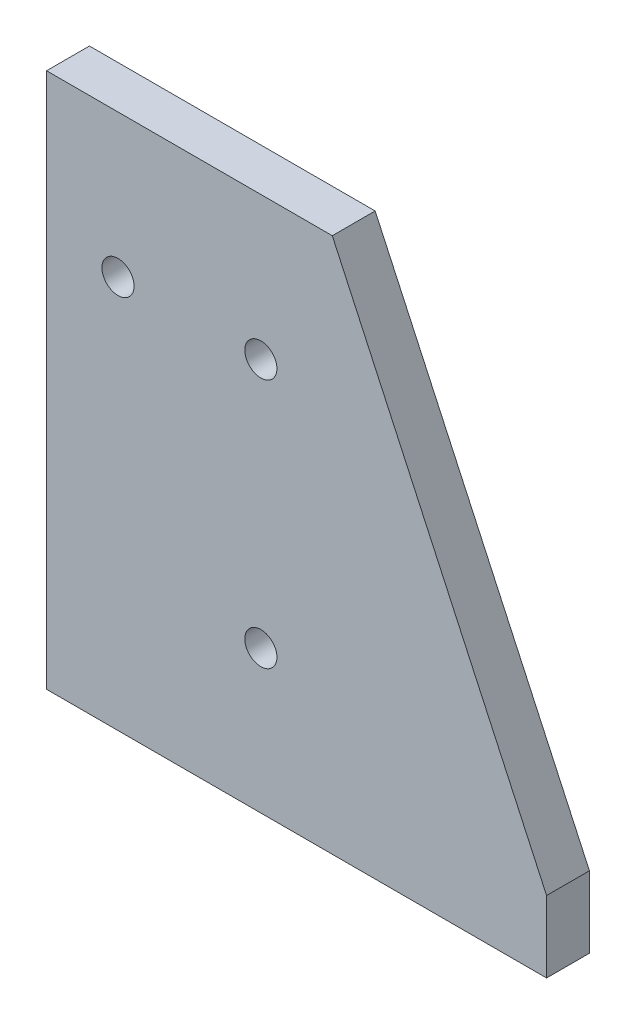
ISO-10303-21;
HEADER;
FILE_DESCRIPTION(('STEP AP214'),'2;1');
FILE_NAME('part.step','',(''),(''),'','','');
FILE_SCHEMA(('AUTOMOTIVE_DESIGN { 1 0 10303 214 1 1 1 1 }'));
ENDSEC;
DATA;
#1=APPLICATION_CONTEXT('core data for automotive mechanical design processes');
#2=APPLICATION_PROTOCOL_DEFINITION('international standard','automotive_design',2000,#1);
#3=PRODUCT_CONTEXT('',#1,'mechanical');
#4=PRODUCT('Part','Part','',(#3));
#5=PRODUCT_RELATED_PRODUCT_CATEGORY('part','',(#4));
#6=PRODUCT_DEFINITION_FORMATION('','',#4);
#7=PRODUCT_DEFINITION_CONTEXT('part definition',#1,'design');
#8=PRODUCT_DEFINITION('design','',#6,#7);
#9=PRODUCT_DEFINITION_SHAPE('','',#8);
#10=(LENGTH_UNIT() NAMED_UNIT(*) SI_UNIT(.MILLI.,.METRE.));
#11=(NAMED_UNIT(*) PLANE_ANGLE_UNIT() SI_UNIT($,.RADIAN.));
#12=(NAMED_UNIT(*) SI_UNIT($,.STERADIAN.) SOLID_ANGLE_UNIT());
#13=UNCERTAINTY_MEASURE_WITH_UNIT(LENGTH_MEASURE(1.E-05),#10,'distance_accuracy_value','');
#14=(GEOMETRIC_REPRESENTATION_CONTEXT(3) GLOBAL_UNCERTAINTY_ASSIGNED_CONTEXT((#13)) GLOBAL_UNIT_ASSIGNED_CONTEXT((#10,
#11,#12)) REPRESENTATION_CONTEXT('',''));
#15=CARTESIAN_POINT('',(0.,0.,0.));
#16=DIRECTION('',(0.,0.,1.));
#17=DIRECTION('',(1.,0.,0.));
#18=AXIS2_PLACEMENT_3D('',#15,#16,#17);
#19=CARTESIAN_POINT('',(0.,150.,12.));
#20=DIRECTION('',(1.,0.,0.));
#21=DIRECTION('',(0.,0.,-1.));
#22=AXIS2_PLACEMENT_3D('',#19,#20,#21);
#23=PLANE('',#22);
#24=DIRECTION('',(0.,-1.,0.));
#25=VECTOR('',#24,1.);
#26=CARTESIAN_POINT('',(0.,150.,0.));
#27=LINE('',#26,#25);
#28=CARTESIAN_POINT('',(0.,150.,0.));
#29=VERTEX_POINT('',#28);
#30=CARTESIAN_POINT('',(0.,0.,0.));
#31=VERTEX_POINT('',#30);
#32=EDGE_CURVE('E123',#29,#31,#27,.T.);
#33=ORIENTED_EDGE('',*,*,#32,.T.);
#34=DIRECTION('',(0.,0.,-1.));
#35=VECTOR('',#34,1.);
#36=CARTESIAN_POINT('',(0.,0.,12.));
#37=LINE('',#36,#35);
#38=CARTESIAN_POINT('',(0.,0.,12.));
#39=VERTEX_POINT('',#38);
#40=EDGE_CURVE('E11',#39,#31,#37,.T.);
#41=ORIENTED_EDGE('',*,*,#40,.F.);
#42=DIRECTION('',(0.,-1.,0.));
#43=VECTOR('',#42,1.);
#44=CARTESIAN_POINT('',(0.,150.,12.));
#45=LINE('',#44,#43);
#46=CARTESIAN_POINT('',(0.,150.,12.));
#47=VERTEX_POINT('',#46);
#48=EDGE_CURVE('E136',#47,#39,#45,.T.);
#49=ORIENTED_EDGE('',*,*,#48,.F.);
#50=DIRECTION('',(0.,0.,-1.));
#51=VECTOR('',#50,1.);
#52=CARTESIAN_POINT('',(0.,150.,12.));
#53=LINE('',#52,#51);
#54=EDGE_CURVE('E119',#47,#29,#53,.T.);
#55=ORIENTED_EDGE('',*,*,#54,.T.);
#56=EDGE_LOOP('',(#33,#41,#49,#55));
#57=FACE_BOUND('',#56,.T.);
#58=ADVANCED_FACE('F41',(#57),#23,.F.);
#59=CARTESIAN_POINT('',(0.,0.,12.));
#60=DIRECTION('',(0.,1.,0.));
#61=DIRECTION('',(0.,0.,1.));
#62=AXIS2_PLACEMENT_3D('',#59,#60,#61);
#63=PLANE('',#62);
#64=CARTESIAN_POINT('',(100.,0.,6.));
#65=DIRECTION('',(0.,1.,0.));
#66=DIRECTION('',(0.,0.,1.));
#67=AXIS2_PLACEMENT_3D('',#64,#65,#66);
#68=CIRCLE('',#67,2.5);
#69=CARTESIAN_POINT('',(100.,0.,8.5));
#70=VERTEX_POINT('',#69);
#71=EDGE_CURVE('E287',#70,#70,#68,.T.);
#72=ORIENTED_EDGE('',*,*,#71,.T.);
#73=EDGE_LOOP('',(#72));
#74=FACE_BOUND('',#73,.T.);
#75=CARTESIAN_POINT('',(125.,0.,6.));
#76=DIRECTION('',(0.,1.,0.));
#77=DIRECTION('',(0.,0.,1.));
#78=AXIS2_PLACEMENT_3D('',#75,#76,#77);
#79=CIRCLE('',#78,2.5);
#80=CARTESIAN_POINT('',(125.,0.,8.5));
#81=VERTEX_POINT('',#80);
#82=EDGE_CURVE('E296',#81,#81,#79,.T.);
#83=ORIENTED_EDGE('',*,*,#82,.T.);
#84=EDGE_LOOP('',(#83));
#85=FACE_BOUND('',#84,.T.);
#86=DIRECTION('',(1.,0.,0.));
#87=VECTOR('',#86,1.);
#88=CARTESIAN_POINT('',(0.,0.,0.));
#89=LINE('',#88,#87);
#90=CARTESIAN_POINT('',(140.,0.,0.));
#91=VERTEX_POINT('',#90);
#92=EDGE_CURVE('E127',#31,#91,#89,.T.);
#93=ORIENTED_EDGE('',*,*,#92,.T.);
#94=DIRECTION('',(0.,0.,-1.));
#95=VECTOR('',#94,1.);
#96=CARTESIAN_POINT('',(140.,0.,12.));
#97=LINE('',#96,#95);
#98=CARTESIAN_POINT('',(140.,0.,12.));
#99=VERTEX_POINT('',#98);
#100=EDGE_CURVE('E51',#99,#91,#97,.T.);
#101=ORIENTED_EDGE('',*,*,#100,.F.);
#102=DIRECTION('',(1.,0.,0.));
#103=VECTOR('',#102,1.);
#104=CARTESIAN_POINT('',(0.,0.,12.));
#105=LINE('',#104,#103);
#106=EDGE_CURVE('E94',#39,#99,#105,.T.);
#107=ORIENTED_EDGE('',*,*,#106,.F.);
#108=ORIENTED_EDGE('',*,*,#40,.T.);
#109=EDGE_LOOP('',(#93,#101,#107,#108));
#110=FACE_BOUND('',#109,.T.);
#111=ADVANCED_FACE('F180',(#74,#85,#110),#63,.F.);
#112=CARTESIAN_POINT('',(140.,0.,12.));
#113=DIRECTION('',(-1.,0.,0.));
#114=DIRECTION('',(0.,0.,1.));
#115=AXIS2_PLACEMENT_3D('',#112,#113,#114);
#116=PLANE('',#115);
#117=DIRECTION('',(0.,1.,0.));
#118=VECTOR('',#117,1.);
#119=CARTESIAN_POINT('',(140.,0.,0.));
#120=LINE('',#119,#118);
#121=CARTESIAN_POINT('',(140.,20.,0.));
#122=VERTEX_POINT('',#121);
#123=EDGE_CURVE('E110',#91,#122,#120,.T.);
#124=ORIENTED_EDGE('',*,*,#123,.T.);
#125=DIRECTION('',(0.,0.,-1.));
#126=VECTOR('',#125,1.);
#127=CARTESIAN_POINT('',(140.,20.,12.));
#128=LINE('',#127,#126);
#129=CARTESIAN_POINT('',(140.,20.,12.));
#130=VERTEX_POINT('',#129);
#131=EDGE_CURVE('E107',#130,#122,#128,.T.);
#132=ORIENTED_EDGE('',*,*,#131,.F.);
#133=DIRECTION('',(0.,1.,0.));
#134=VECTOR('',#133,1.);
#135=CARTESIAN_POINT('',(140.,0.,12.));
#136=LINE('',#135,#134);
#137=EDGE_CURVE('E98',#99,#130,#136,.T.);
#138=ORIENTED_EDGE('',*,*,#137,.F.);
#139=ORIENTED_EDGE('',*,*,#100,.T.);
#140=EDGE_LOOP('',(#124,#132,#138,#139));
#141=FACE_BOUND('',#140,.T.);
#142=ADVANCED_FACE('F108',(#141),#116,.F.);
#143=CARTESIAN_POINT('',(140.,20.,12.));
#144=DIRECTION('',(-0.907959384500452,-0.419058177461747,0.));
#145=DIRECTION('',(0.419058177461747,-0.907959384500452,0.));
#146=AXIS2_PLACEMENT_3D('',#143,#144,#145);
#147=PLANE('',#146);
#148=DIRECTION('',(-0.419058177461747,0.907959384500452,0.));
#149=VECTOR('',#148,1.);
#150=CARTESIAN_POINT('',(140.,20.,0.));
#151=LINE('',#150,#149);
#152=CARTESIAN_POINT('',(80.,150.,0.));
#153=VERTEX_POINT('',#152);
#154=EDGE_CURVE('E80',#122,#153,#151,.T.);
#155=ORIENTED_EDGE('',*,*,#154,.T.);
#156=DIRECTION('',(0.,0.,-1.));
#157=VECTOR('',#156,1.);
#158=CARTESIAN_POINT('',(80.,150.,12.));
#159=LINE('',#158,#157);
#160=CARTESIAN_POINT('',(80.,150.,12.));
#161=VERTEX_POINT('',#160);
#162=EDGE_CURVE('E112',#161,#153,#159,.T.);
#163=ORIENTED_EDGE('',*,*,#162,.F.);
#164=DIRECTION('',(-0.419058177461747,0.907959384500452,0.));
#165=VECTOR('',#164,1.);
#166=CARTESIAN_POINT('',(140.,20.,12.));
#167=LINE('',#166,#165);
#168=EDGE_CURVE('E102',#130,#161,#167,.T.);
#169=ORIENTED_EDGE('',*,*,#168,.F.);
#170=ORIENTED_EDGE('',*,*,#131,.T.);
#171=EDGE_LOOP('',(#155,#163,#169,#170));
#172=FACE_BOUND('',#171,.T.);
#173=ADVANCED_FACE('F114',(#172),#147,.F.);
#174=CARTESIAN_POINT('',(80.,150.,12.));
#175=DIRECTION('',(0.,-1.,0.));
#176=DIRECTION('',(0.,0.,-1.));
#177=AXIS2_PLACEMENT_3D('',#174,#175,#176);
#178=PLANE('',#177);
#179=DIRECTION('',(-1.,0.,0.));
#180=VECTOR('',#179,1.);
#181=CARTESIAN_POINT('',(80.,150.,0.));
#182=LINE('',#181,#180);
#183=EDGE_CURVE('E86',#153,#29,#182,.T.);
#184=ORIENTED_EDGE('',*,*,#183,.T.);
#185=ORIENTED_EDGE('',*,*,#54,.F.);
#186=DIRECTION('',(-1.,0.,0.));
#187=VECTOR('',#186,1.);
#188=CARTESIAN_POINT('',(80.,150.,12.));
#189=LINE('',#188,#187);
#190=EDGE_CURVE('E60',#161,#47,#189,.T.);
#191=ORIENTED_EDGE('',*,*,#190,.F.);
#192=ORIENTED_EDGE('',*,*,#162,.T.);
#193=EDGE_LOOP('',(#184,#185,#191,#192));
#194=FACE_BOUND('',#193,.T.);
#195=ADVANCED_FACE('F198',(#194),#178,.F.);
#196=CARTESIAN_POINT('',(0.,0.,12.));
#197=DIRECTION('',(0.,0.,1.));
#198=DIRECTION('',(1.,0.,0.));
#199=AXIS2_PLACEMENT_3D('',#196,#197,#198);
#200=PLANE('',#199);
#201=CARTESIAN_POINT('',(20.,110.,12.));
#202=DIRECTION('',(0.,0.,1.));
#203=DIRECTION('',(1.,0.,0.));
#204=AXIS2_PLACEMENT_3D('',#201,#202,#203);
#205=CIRCLE('',#204,4.5);
#206=CARTESIAN_POINT('',(24.5,110.,12.));
#207=VERTEX_POINT('',#206);
#208=EDGE_CURVE('E147',#207,#207,#205,.T.);
#209=ORIENTED_EDGE('',*,*,#208,.F.);
#210=EDGE_LOOP('',(#209));
#211=FACE_BOUND('',#210,.T.);
#212=CARTESIAN_POINT('',(60.,110.,12.));
#213=DIRECTION('',(0.,0.,1.));
#214=DIRECTION('',(1.,0.,0.));
#215=AXIS2_PLACEMENT_3D('',#212,#213,#214);
#216=CIRCLE('',#215,4.5);
#217=CARTESIAN_POINT('',(64.5,110.,12.));
#218=VERTEX_POINT('',#217);
#219=EDGE_CURVE('E293',#218,#218,#216,.T.);
#220=ORIENTED_EDGE('',*,*,#219,.F.);
#221=EDGE_LOOP('',(#220));
#222=FACE_BOUND('',#221,.T.);
#223=CARTESIAN_POINT('',(60.,40.,12.));
#224=DIRECTION('',(0.,0.,1.));
#225=DIRECTION('',(1.,0.,0.));
#226=AXIS2_PLACEMENT_3D('',#223,#224,#225);
#227=CIRCLE('',#226,4.5);
#228=CARTESIAN_POINT('',(64.5,40.,12.));
#229=VERTEX_POINT('',#228);
#230=EDGE_CURVE('E286',#229,#229,#227,.T.);
#231=ORIENTED_EDGE('',*,*,#230,.F.);
#232=EDGE_LOOP('',(#231));
#233=FACE_BOUND('',#232,.T.);
#234=ORIENTED_EDGE('',*,*,#48,.T.);
#235=ORIENTED_EDGE('',*,*,#106,.T.);
#236=ORIENTED_EDGE('',*,*,#137,.T.);
#237=ORIENTED_EDGE('',*,*,#168,.T.);
#238=ORIENTED_EDGE('',*,*,#190,.T.);
#239=EDGE_LOOP('',(#234,#235,#236,#237,#238));
#240=FACE_BOUND('',#239,.T.);
#241=ADVANCED_FACE('F100',(#211,#222,#233,#240),#200,.T.);
#242=CARTESIAN_POINT('',(0.,0.,0.));
#243=DIRECTION('',(0.,0.,1.));
#244=DIRECTION('',(1.,0.,0.));
#245=AXIS2_PLACEMENT_3D('',#242,#243,#244);
#246=PLANE('',#245);
#247=CARTESIAN_POINT('',(20.,110.,0.));
#248=DIRECTION('',(0.,0.,1.));
#249=DIRECTION('',(1.,0.,0.));
#250=AXIS2_PLACEMENT_3D('',#247,#248,#249);
#251=CIRCLE('',#250,4.5);
#252=CARTESIAN_POINT('',(24.5,110.,0.));
#253=VERTEX_POINT('',#252);
#254=EDGE_CURVE('E44',#253,#253,#251,.T.);
#255=ORIENTED_EDGE('',*,*,#254,.T.);
#256=EDGE_LOOP('',(#255));
#257=FACE_BOUND('',#256,.T.);
#258=CARTESIAN_POINT('',(60.,110.,0.));
#259=DIRECTION('',(0.,0.,1.));
#260=DIRECTION('',(1.,0.,0.));
#261=AXIS2_PLACEMENT_3D('',#258,#259,#260);
#262=CIRCLE('',#261,4.5);
#263=CARTESIAN_POINT('',(64.5,110.,0.));
#264=VERTEX_POINT('',#263);
#265=EDGE_CURVE('E146',#264,#264,#262,.T.);
#266=ORIENTED_EDGE('',*,*,#265,.T.);
#267=EDGE_LOOP('',(#266));
#268=FACE_BOUND('',#267,.T.);
#269=CARTESIAN_POINT('',(60.,40.,0.));
#270=DIRECTION('',(0.,0.,1.));
#271=DIRECTION('',(1.,0.,0.));
#272=AXIS2_PLACEMENT_3D('',#269,#270,#271);
#273=CIRCLE('',#272,4.5);
#274=CARTESIAN_POINT('',(64.5,40.,0.));
#275=VERTEX_POINT('',#274);
#276=EDGE_CURVE('E143',#275,#275,#273,.T.);
#277=ORIENTED_EDGE('',*,*,#276,.T.);
#278=EDGE_LOOP('',(#277));
#279=FACE_BOUND('',#278,.T.);
#280=ORIENTED_EDGE('',*,*,#32,.F.);
#281=ORIENTED_EDGE('',*,*,#183,.F.);
#282=ORIENTED_EDGE('',*,*,#154,.F.);
#283=ORIENTED_EDGE('',*,*,#123,.F.);
#284=ORIENTED_EDGE('',*,*,#92,.F.);
#285=EDGE_LOOP('',(#280,#281,#282,#283,#284));
#286=FACE_BOUND('',#285,.T.);
#287=ADVANCED_FACE('F158',(#257,#268,#279,#286),#246,.F.);
#288=CARTESIAN_POINT('',(60.,40.,-1.2E-05));
#289=DIRECTION('',(0.,0.,1.));
#290=DIRECTION('',(1.,0.,0.));
#291=AXIS2_PLACEMENT_3D('',#288,#289,#290);
#292=CYLINDRICAL_SURFACE('',#291,4.5);
#293=CARTESIAN_POINT('',(64.5,40.,12.));
#294=CARTESIAN_POINT('',(64.5,40.,11.875));
#295=CARTESIAN_POINT('',(64.5,40.,11.75));
#296=CARTESIAN_POINT('',(64.5,40.,11.5));
#297=CARTESIAN_POINT('',(64.5,40.,11.375));
#298=CARTESIAN_POINT('',(64.5,40.,11.125));
#299=CARTESIAN_POINT('',(64.5,40.,11.));
#300=CARTESIAN_POINT('',(64.5,40.,10.75));
#301=CARTESIAN_POINT('',(64.5,40.,10.625));
#302=CARTESIAN_POINT('',(64.5,40.,10.375));
#303=CARTESIAN_POINT('',(64.5,40.,10.25));
#304=CARTESIAN_POINT('',(64.5,40.,10.));
#305=CARTESIAN_POINT('',(64.5,40.,9.875));
#306=CARTESIAN_POINT('',(64.5,40.,9.625));
#307=CARTESIAN_POINT('',(64.5,40.,9.5));
#308=CARTESIAN_POINT('',(64.5,40.,9.25));
#309=CARTESIAN_POINT('',(64.5,40.,9.125));
#310=CARTESIAN_POINT('',(64.5,40.,8.875));
#311=CARTESIAN_POINT('',(64.5,40.,8.75));
#312=CARTESIAN_POINT('',(64.5,40.,8.5));
#313=CARTESIAN_POINT('',(64.5,40.,8.375));
#314=CARTESIAN_POINT('',(64.5,40.,8.125));
#315=CARTESIAN_POINT('',(64.5,40.,8.));
#316=CARTESIAN_POINT('',(64.5,40.,7.75));
#317=CARTESIAN_POINT('',(64.5,40.,7.625));
#318=CARTESIAN_POINT('',(64.5,40.,7.375));
#319=CARTESIAN_POINT('',(64.5,40.,7.25));
#320=CARTESIAN_POINT('',(64.5,40.,7.));
#321=CARTESIAN_POINT('',(64.5,40.,6.875));
#322=CARTESIAN_POINT('',(64.5,40.,6.625));
#323=CARTESIAN_POINT('',(64.5,40.,6.5));
#324=CARTESIAN_POINT('',(64.5,40.,6.25));
#325=CARTESIAN_POINT('',(64.5,40.,6.125));
#326=CARTESIAN_POINT('',(64.5,40.,5.875));
#327=CARTESIAN_POINT('',(64.5,40.,5.75));
#328=CARTESIAN_POINT('',(64.5,40.,5.5));
#329=CARTESIAN_POINT('',(64.5,40.,5.375));
#330=CARTESIAN_POINT('',(64.5,40.,5.125));
#331=CARTESIAN_POINT('',(64.5,40.,5.));
#332=CARTESIAN_POINT('',(64.5,40.,4.75));
#333=CARTESIAN_POINT('',(64.5,40.,4.625));
#334=CARTESIAN_POINT('',(64.5,40.,4.375));
#335=CARTESIAN_POINT('',(64.5,40.,4.25));
#336=CARTESIAN_POINT('',(64.5,40.,4.));
#337=CARTESIAN_POINT('',(64.5,40.,3.875));
#338=CARTESIAN_POINT('',(64.5,40.,3.625));
#339=CARTESIAN_POINT('',(64.5,40.,3.5));
#340=CARTESIAN_POINT('',(64.5,40.,3.25));
#341=CARTESIAN_POINT('',(64.5,40.,3.125));
#342=CARTESIAN_POINT('',(64.5,40.,2.875));
#343=CARTESIAN_POINT('',(64.5,40.,2.75));
#344=CARTESIAN_POINT('',(64.5,40.,2.5));
#345=CARTESIAN_POINT('',(64.5,40.,2.375));
#346=CARTESIAN_POINT('',(64.5,40.,2.125));
#347=CARTESIAN_POINT('',(64.5,40.,2.));
#348=CARTESIAN_POINT('',(64.5,40.,1.75));
#349=CARTESIAN_POINT('',(64.5,40.,1.625));
#350=CARTESIAN_POINT('',(64.5,40.,1.375));
#351=CARTESIAN_POINT('',(64.5,40.,1.25));
#352=CARTESIAN_POINT('',(64.5,40.,1.));
#353=CARTESIAN_POINT('',(64.5,40.,0.875000000000001));
#354=CARTESIAN_POINT('',(64.5,40.,0.625000000000001));
#355=CARTESIAN_POINT('',(64.5,40.,0.500000000000001));
#356=CARTESIAN_POINT('',(64.5,40.,0.250000000000001));
#357=CARTESIAN_POINT('',(64.5,40.,0.125000000000001));
#358=CARTESIAN_POINT('',(64.5,40.,0.));
#359=B_SPLINE_CURVE_WITH_KNOTS('',3,(#293,#294,#295,#296,#297,#298,#299,#300,#301,#302,#303,
#304,#305,#306,#307,#308,#309,#310,#311,#312,#313,#314,#315,#316,#317,#318,#319,#320,#321,#322,
#323,#324,#325,#326,#327,#328,#329,#330,#331,#332,#333,#334,#335,#336,#337,#338,#339,#340,#341,
#342,#343,#344,#345,#346,#347,#348,#349,#350,#351,#352,#353,#354,#355,#356,#357,#358),
.UNSPECIFIED.,.F.,.F.,(4,2,2,2,2,2,2,2,2,2,2,2,2,2,2,2,2,2,2,2,2,2,2,2,2,2,2,2,2,2,2,2,4),(0.,
0.375,0.750000000000001,1.125,1.5,1.875,2.25,2.625,3.,3.375,3.75,4.125,4.5,4.875,5.25,5.625,6.,
6.375,6.75,7.125,7.5,7.875,8.25,8.625,9.,9.375,9.75,10.125,10.5,10.875,11.25,11.625,12.),.UNSPECIFIED.);
#360=EDGE_CURVE('BSEAM174',#229,#275,#359,.T.);
#361=ORIENTED_EDGE('',*,*,#230,.T.);
#362=ORIENTED_EDGE('',*,*,#276,.F.);
#363=ORIENTED_EDGE('',*,*,#360,.T.);
#364=ORIENTED_EDGE('',*,*,#360,.F.);
#365=EDGE_LOOP('',(#361,#363,#362,#364));
#366=FACE_BOUND('',#365,.T.);
#367=ADVANCED_FACE('F174',(#366),#292,.F.);
#368=CARTESIAN_POINT('',(60.,110.,-1.2E-05));
#369=DIRECTION('',(0.,0.,1.));
#370=DIRECTION('',(1.,0.,0.));
#371=AXIS2_PLACEMENT_3D('',#368,#369,#370);
#372=CYLINDRICAL_SURFACE('',#371,4.5);
#373=CARTESIAN_POINT('',(64.5,110.,12.));
#374=CARTESIAN_POINT('',(64.5,110.,11.875));
#375=CARTESIAN_POINT('',(64.5,110.,11.75));
#376=CARTESIAN_POINT('',(64.5,110.,11.5));
#377=CARTESIAN_POINT('',(64.5,110.,11.375));
#378=CARTESIAN_POINT('',(64.5,110.,11.125));
#379=CARTESIAN_POINT('',(64.5,110.,11.));
#380=CARTESIAN_POINT('',(64.5,110.,10.75));
#381=CARTESIAN_POINT('',(64.5,110.,10.625));
#382=CARTESIAN_POINT('',(64.5,110.,10.375));
#383=CARTESIAN_POINT('',(64.5,110.,10.25));
#384=CARTESIAN_POINT('',(64.5,110.,10.));
#385=CARTESIAN_POINT('',(64.5,110.,9.875));
#386=CARTESIAN_POINT('',(64.5,110.,9.625));
#387=CARTESIAN_POINT('',(64.5,110.,9.5));
#388=CARTESIAN_POINT('',(64.5,110.,9.25));
#389=CARTESIAN_POINT('',(64.5,110.,9.125));
#390=CARTESIAN_POINT('',(64.5,110.,8.875));
#391=CARTESIAN_POINT('',(64.5,110.,8.75));
#392=CARTESIAN_POINT('',(64.5,110.,8.5));
#393=CARTESIAN_POINT('',(64.5,110.,8.375));
#394=CARTESIAN_POINT('',(64.5,110.,8.125));
#395=CARTESIAN_POINT('',(64.5,110.,8.));
#396=CARTESIAN_POINT('',(64.5,110.,7.75));
#397=CARTESIAN_POINT('',(64.5,110.,7.625));
#398=CARTESIAN_POINT('',(64.5,110.,7.375));
#399=CARTESIAN_POINT('',(64.5,110.,7.25));
#400=CARTESIAN_POINT('',(64.5,110.,7.));
#401=CARTESIAN_POINT('',(64.5,110.,6.875));
#402=CARTESIAN_POINT('',(64.5,110.,6.625));
#403=CARTESIAN_POINT('',(64.5,110.,6.5));
#404=CARTESIAN_POINT('',(64.5,110.,6.25));
#405=CARTESIAN_POINT('',(64.5,110.,6.125));
#406=CARTESIAN_POINT('',(64.5,110.,5.875));
#407=CARTESIAN_POINT('',(64.5,110.,5.75));
#408=CARTESIAN_POINT('',(64.5,110.,5.5));
#409=CARTESIAN_POINT('',(64.5,110.,5.375));
#410=CARTESIAN_POINT('',(64.5,110.,5.125));
#411=CARTESIAN_POINT('',(64.5,110.,5.));
#412=CARTESIAN_POINT('',(64.5,110.,4.75));
#413=CARTESIAN_POINT('',(64.5,110.,4.625));
#414=CARTESIAN_POINT('',(64.5,110.,4.375));
#415=CARTESIAN_POINT('',(64.5,110.,4.25));
#416=CARTESIAN_POINT('',(64.5,110.,4.));
#417=CARTESIAN_POINT('',(64.5,110.,3.875));
#418=CARTESIAN_POINT('',(64.5,110.,3.625));
#419=CARTESIAN_POINT('',(64.5,110.,3.5));
#420=CARTESIAN_POINT('',(64.5,110.,3.25));
#421=CARTESIAN_POINT('',(64.5,110.,3.125));
#422=CARTESIAN_POINT('',(64.5,110.,2.875));
#423=CARTESIAN_POINT('',(64.5,110.,2.75));
#424=CARTESIAN_POINT('',(64.5,110.,2.5));
#425=CARTESIAN_POINT('',(64.5,110.,2.375));
#426=CARTESIAN_POINT('',(64.5,110.,2.125));
#427=CARTESIAN_POINT('',(64.5,110.,2.));
#428=CARTESIAN_POINT('',(64.5,110.,1.75));
#429=CARTESIAN_POINT('',(64.5,110.,1.625));
#430=CARTESIAN_POINT('',(64.5,110.,1.375));
#431=CARTESIAN_POINT('',(64.5,110.,1.25));
#432=CARTESIAN_POINT('',(64.5,110.,1.));
#433=CARTESIAN_POINT('',(64.5,110.,0.875000000000001));
#434=CARTESIAN_POINT('',(64.5,110.,0.625000000000001));
#435=CARTESIAN_POINT('',(64.5,110.,0.500000000000001));
#436=CARTESIAN_POINT('',(64.5,110.,0.250000000000001));
#437=CARTESIAN_POINT('',(64.5,110.,0.125000000000001));
#438=CARTESIAN_POINT('',(64.5,110.,0.));
#439=B_SPLINE_CURVE_WITH_KNOTS('',3,(#373,#374,#375,#376,#377,#378,#379,#380,#381,#382,#383,
#384,#385,#386,#387,#388,#389,#390,#391,#392,#393,#394,#395,#396,#397,#398,#399,#400,#401,#402,
#403,#404,#405,#406,#407,#408,#409,#410,#411,#412,#413,#414,#415,#416,#417,#418,#419,#420,#421,
#422,#423,#424,#425,#426,#427,#428,#429,#430,#431,#432,#433,#434,#435,#436,#437,#438),
.UNSPECIFIED.,.F.,.F.,(4,2,2,2,2,2,2,2,2,2,2,2,2,2,2,2,2,2,2,2,2,2,2,2,2,2,2,2,2,2,2,2,4),(0.,
0.375,0.750000000000001,1.125,1.5,1.875,2.25,2.625,3.,3.375,3.75,4.125,4.5,4.875,5.25,5.625,6.,
6.375,6.75,7.125,7.5,7.875,8.25,8.625,9.,9.375,9.75,10.125,10.5,10.875,11.25,11.625,12.),.UNSPECIFIED.);
#440=EDGE_CURVE('BSEAM163',#218,#264,#439,.T.);
#441=ORIENTED_EDGE('',*,*,#219,.T.);
#442=ORIENTED_EDGE('',*,*,#265,.F.);
#443=ORIENTED_EDGE('',*,*,#440,.T.);
#444=ORIENTED_EDGE('',*,*,#440,.F.);
#445=EDGE_LOOP('',(#441,#443,#442,#444));
#446=FACE_BOUND('',#445,.T.);
#447=ADVANCED_FACE('F163',(#446),#372,.F.);
#448=CARTESIAN_POINT('',(20.,110.,-1.2E-05));
#449=DIRECTION('',(0.,0.,1.));
#450=DIRECTION('',(1.,0.,0.));
#451=AXIS2_PLACEMENT_3D('',#448,#449,#450);
#452=CYLINDRICAL_SURFACE('',#451,4.5);
#453=CARTESIAN_POINT('',(24.5,110.,12.));
#454=CARTESIAN_POINT('',(24.5,110.,11.875));
#455=CARTESIAN_POINT('',(24.5,110.,11.75));
#456=CARTESIAN_POINT('',(24.5,110.,11.5));
#457=CARTESIAN_POINT('',(24.5,110.,11.375));
#458=CARTESIAN_POINT('',(24.5,110.,11.125));
#459=CARTESIAN_POINT('',(24.5,110.,11.));
#460=CARTESIAN_POINT('',(24.5,110.,10.75));
#461=CARTESIAN_POINT('',(24.5,110.,10.625));
#462=CARTESIAN_POINT('',(24.5,110.,10.375));
#463=CARTESIAN_POINT('',(24.5,110.,10.25));
#464=CARTESIAN_POINT('',(24.5,110.,10.));
#465=CARTESIAN_POINT('',(24.5,110.,9.875));
#466=CARTESIAN_POINT('',(24.5,110.,9.625));
#467=CARTESIAN_POINT('',(24.5,110.,9.5));
#468=CARTESIAN_POINT('',(24.5,110.,9.25));
#469=CARTESIAN_POINT('',(24.5,110.,9.125));
#470=CARTESIAN_POINT('',(24.5,110.,8.875));
#471=CARTESIAN_POINT('',(24.5,110.,8.75));
#472=CARTESIAN_POINT('',(24.5,110.,8.5));
#473=CARTESIAN_POINT('',(24.5,110.,8.375));
#474=CARTESIAN_POINT('',(24.5,110.,8.125));
#475=CARTESIAN_POINT('',(24.5,110.,8.));
#476=CARTESIAN_POINT('',(24.5,110.,7.75));
#477=CARTESIAN_POINT('',(24.5,110.,7.625));
#478=CARTESIAN_POINT('',(24.5,110.,7.375));
#479=CARTESIAN_POINT('',(24.5,110.,7.25));
#480=CARTESIAN_POINT('',(24.5,110.,7.));
#481=CARTESIAN_POINT('',(24.5,110.,6.875));
#482=CARTESIAN_POINT('',(24.5,110.,6.625));
#483=CARTESIAN_POINT('',(24.5,110.,6.5));
#484=CARTESIAN_POINT('',(24.5,110.,6.25));
#485=CARTESIAN_POINT('',(24.5,110.,6.125));
#486=CARTESIAN_POINT('',(24.5,110.,5.875));
#487=CARTESIAN_POINT('',(24.5,110.,5.75));
#488=CARTESIAN_POINT('',(24.5,110.,5.5));
#489=CARTESIAN_POINT('',(24.5,110.,5.375));
#490=CARTESIAN_POINT('',(24.5,110.,5.125));
#491=CARTESIAN_POINT('',(24.5,110.,5.));
#492=CARTESIAN_POINT('',(24.5,110.,4.75));
#493=CARTESIAN_POINT('',(24.5,110.,4.625));
#494=CARTESIAN_POINT('',(24.5,110.,4.375));
#495=CARTESIAN_POINT('',(24.5,110.,4.25));
#496=CARTESIAN_POINT('',(24.5,110.,4.));
#497=CARTESIAN_POINT('',(24.5,110.,3.875));
#498=CARTESIAN_POINT('',(24.5,110.,3.625));
#499=CARTESIAN_POINT('',(24.5,110.,3.5));
#500=CARTESIAN_POINT('',(24.5,110.,3.25));
#501=CARTESIAN_POINT('',(24.5,110.,3.125));
#502=CARTESIAN_POINT('',(24.5,110.,2.875));
#503=CARTESIAN_POINT('',(24.5,110.,2.75));
#504=CARTESIAN_POINT('',(24.5,110.,2.5));
#505=CARTESIAN_POINT('',(24.5,110.,2.375));
#506=CARTESIAN_POINT('',(24.5,110.,2.125));
#507=CARTESIAN_POINT('',(24.5,110.,2.));
#508=CARTESIAN_POINT('',(24.5,110.,1.75));
#509=CARTESIAN_POINT('',(24.5,110.,1.625));
#510=CARTESIAN_POINT('',(24.5,110.,1.375));
#511=CARTESIAN_POINT('',(24.5,110.,1.25));
#512=CARTESIAN_POINT('',(24.5,110.,1.));
#513=CARTESIAN_POINT('',(24.5,110.,0.875000000000001));
#514=CARTESIAN_POINT('',(24.5,110.,0.625000000000001));
#515=CARTESIAN_POINT('',(24.5,110.,0.500000000000001));
#516=CARTESIAN_POINT('',(24.5,110.,0.250000000000001));
#517=CARTESIAN_POINT('',(24.5,110.,0.125000000000001));
#518=CARTESIAN_POINT('',(24.5,110.,0.));
#519=B_SPLINE_CURVE_WITH_KNOTS('',3,(#453,#454,#455,#456,#457,#458,#459,#460,#461,#462,#463,
#464,#465,#466,#467,#468,#469,#470,#471,#472,#473,#474,#475,#476,#477,#478,#479,#480,#481,#482,
#483,#484,#485,#486,#487,#488,#489,#490,#491,#492,#493,#494,#495,#496,#497,#498,#499,#500,#501,
#502,#503,#504,#505,#506,#507,#508,#509,#510,#511,#512,#513,#514,#515,#516,#517,#518),
.UNSPECIFIED.,.F.,.F.,(4,2,2,2,2,2,2,2,2,2,2,2,2,2,2,2,2,2,2,2,2,2,2,2,2,2,2,2,2,2,2,2,4),(0.,
0.375,0.750000000000001,1.125,1.5,1.875,2.25,2.625,3.,3.375,3.75,4.125,4.5,4.875,5.25,5.625,6.,
6.375,6.75,7.125,7.5,7.875,8.25,8.625,9.,9.375,9.75,10.125,10.5,10.875,11.25,11.625,12.),.UNSPECIFIED.);
#520=EDGE_CURVE('BSEAM160',#207,#253,#519,.T.);
#521=ORIENTED_EDGE('',*,*,#208,.T.);
#522=ORIENTED_EDGE('',*,*,#254,.F.);
#523=ORIENTED_EDGE('',*,*,#520,.T.);
#524=ORIENTED_EDGE('',*,*,#520,.F.);
#525=EDGE_LOOP('',(#521,#523,#522,#524));
#526=FACE_BOUND('',#525,.T.);
#527=ADVANCED_FACE('F160',(#526),#452,.F.);
#528=CARTESIAN_POINT('',(125.,15.,6.));
#529=DIRECTION('',(0.,-1.,0.));
#530=DIRECTION('',(0.,0.,-1.));
#531=AXIS2_PLACEMENT_3D('',#528,#529,#530);
#532=CYLINDRICAL_SURFACE('',#531,2.5);
#533=CARTESIAN_POINT('',(125.,15.,6.));
#534=DIRECTION('',(0.,1.,0.));
#535=DIRECTION('',(0.,0.,1.));
#536=AXIS2_PLACEMENT_3D('',#533,#534,#535);
#537=CIRCLE('',#536,2.5);
#538=CARTESIAN_POINT('',(125.,15.,8.5));
#539=VERTEX_POINT('',#538);
#540=EDGE_CURVE('E302',#539,#539,#537,.T.);
#541=ORIENTED_EDGE('',*,*,#540,.T.);
#542=EDGE_LOOP('',(#541));
#543=FACE_BOUND('',#542,.T.);
#544=ORIENTED_EDGE('',*,*,#82,.F.);
#545=EDGE_LOOP('',(#544));
#546=FACE_BOUND('',#545,.T.);
#547=ADVANCED_FACE('F162',(#543,#546),#532,.F.);
#548=CARTESIAN_POINT('',(125.,15.,6.));
#549=DIRECTION('',(0.,1.,0.));
#550=DIRECTION('',(0.,0.,1.));
#551=AXIS2_PLACEMENT_3D('',#548,#549,#550);
#552=PLANE('',#551);
#553=ORIENTED_EDGE('',*,*,#540,.F.);
#554=EDGE_LOOP('',(#553));
#555=FACE_BOUND('',#554,.T.);
#556=ADVANCED_FACE('F171',(#555),#552,.F.);
#557=CARTESIAN_POINT('',(100.,15.,6.));
#558=DIRECTION('',(0.,-1.,0.));
#559=DIRECTION('',(0.,0.,-1.));
#560=AXIS2_PLACEMENT_3D('',#557,#558,#559);
#561=CYLINDRICAL_SURFACE('',#560,2.5);
#562=CARTESIAN_POINT('',(100.,15.,6.));
#563=DIRECTION('',(0.,1.,0.));
#564=DIRECTION('',(0.,0.,1.));
#565=AXIS2_PLACEMENT_3D('',#562,#563,#564);
#566=CIRCLE('',#565,2.5);
#567=CARTESIAN_POINT('',(100.,15.,8.5));
#568=VERTEX_POINT('',#567);
#569=EDGE_CURVE('E284',#568,#568,#566,.T.);
#570=ORIENTED_EDGE('',*,*,#569,.T.);
#571=EDGE_LOOP('',(#570));
#572=FACE_BOUND('',#571,.T.);
#573=ORIENTED_EDGE('',*,*,#71,.F.);
#574=EDGE_LOOP('',(#573));
#575=FACE_BOUND('',#574,.T.);
#576=ADVANCED_FACE('F260',(#572,#575),#561,.F.);
#577=CARTESIAN_POINT('',(100.,15.,6.));
#578=DIRECTION('',(0.,1.,0.));
#579=DIRECTION('',(0.,0.,1.));
#580=AXIS2_PLACEMENT_3D('',#577,#578,#579);
#581=PLANE('',#580);
#582=ORIENTED_EDGE('',*,*,#569,.F.);
#583=EDGE_LOOP('',(#582));
#584=FACE_BOUND('',#583,.T.);
#585=ADVANCED_FACE('F269',(#584),#581,.F.);
#586=CLOSED_SHELL('',(#58,#111,#142,#173,#195,#241,#287,#367,#447,#527,#547,#556,#576,#585));
#587=MANIFOLD_SOLID_BREP('B2',#586);
#588=ADVANCED_BREP_SHAPE_REPRESENTATION('',(#18,#587),#14);
#589=SHAPE_DEFINITION_REPRESENTATION(#9,#588);
ENDSEC;
END-ISO-10303-21;
